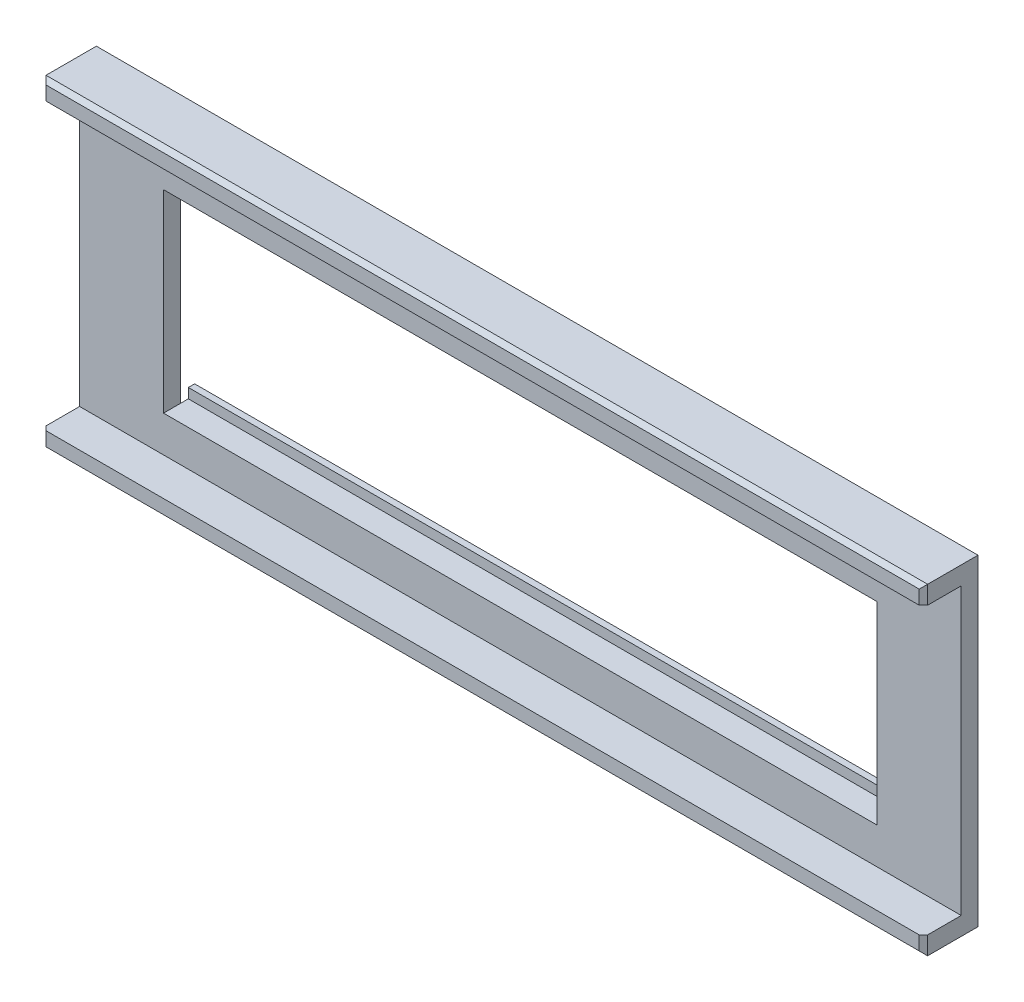
ISO-10303-21;
HEADER;
FILE_DESCRIPTION(('STEP AP214'),'2;1');
FILE_NAME('part.step','',(''),(''),'','','');
FILE_SCHEMA(('AUTOMOTIVE_DESIGN { 1 0 10303 214 1 1 1 1 }'));
ENDSEC;
DATA;
#1=APPLICATION_CONTEXT('core data for automotive mechanical design processes');
#2=APPLICATION_PROTOCOL_DEFINITION('international standard','automotive_design',2000,#1);
#3=PRODUCT_CONTEXT('',#1,'mechanical');
#4=PRODUCT('Part','Part','',(#3));
#5=PRODUCT_RELATED_PRODUCT_CATEGORY('part','',(#4));
#6=PRODUCT_DEFINITION_FORMATION('','',#4);
#7=PRODUCT_DEFINITION_CONTEXT('part definition',#1,'design');
#8=PRODUCT_DEFINITION('design','',#6,#7);
#9=PRODUCT_DEFINITION_SHAPE('','',#8);
#10=(LENGTH_UNIT() NAMED_UNIT(*) SI_UNIT(.MILLI.,.METRE.));
#11=(NAMED_UNIT(*) PLANE_ANGLE_UNIT() SI_UNIT($,.RADIAN.));
#12=(NAMED_UNIT(*) SI_UNIT($,.STERADIAN.) SOLID_ANGLE_UNIT());
#13=UNCERTAINTY_MEASURE_WITH_UNIT(LENGTH_MEASURE(1.E-05),#10,'distance_accuracy_value','');
#14=(GEOMETRIC_REPRESENTATION_CONTEXT(3) GLOBAL_UNCERTAINTY_ASSIGNED_CONTEXT((#13)) GLOBAL_UNIT_ASSIGNED_CONTEXT((#10,
#11,#12)) REPRESENTATION_CONTEXT('',''));
#15=CARTESIAN_POINT('',(0.,0.,0.));
#16=DIRECTION('',(0.,0.,1.));
#17=DIRECTION('',(1.,0.,0.));
#18=AXIS2_PLACEMENT_3D('',#15,#16,#17);
#19=CARTESIAN_POINT('',(105.,-38.325,13.));
#20=DIRECTION('',(-1.,0.,0.));
#21=DIRECTION('',(0.,0.,1.));
#22=AXIS2_PLACEMENT_3D('',#19,#20,#21);
#23=PLANE('',#22);
#24=DIRECTION('',(0.,1.,0.));
#25=VECTOR('',#24,1.);
#26=CARTESIAN_POINT('',(105.,-38.325,0.));
#27=LINE('',#26,#25);
#28=CARTESIAN_POINT('',(105.,-38.325,0.));
#29=VERTEX_POINT('',#28);
#30=CARTESIAN_POINT('',(105.,38.325,0.));
#31=VERTEX_POINT('',#30);
#32=EDGE_CURVE('E357',#29,#31,#27,.T.);
#33=ORIENTED_EDGE('',*,*,#32,.T.);
#34=DIRECTION('',(0.,0.,-1.));
#35=VECTOR('',#34,1.);
#36=CARTESIAN_POINT('',(105.,38.325,13.));
#37=LINE('',#36,#35);
#38=CARTESIAN_POINT('',(105.,38.325,12.));
#39=VERTEX_POINT('',#38);
#40=EDGE_CURVE('E364',#39,#31,#37,.T.);
#41=ORIENTED_EDGE('',*,*,#40,.F.);
#42=DIRECTION('',(0.,-1.,0.));
#43=VECTOR('',#42,1.);
#44=CARTESIAN_POINT('',(105.,-38.325,12.));
#45=LINE('',#44,#43);
#46=CARTESIAN_POINT('',(105.,34.,12.));
#47=VERTEX_POINT('',#46);
#48=EDGE_CURVE('E392',#39,#47,#45,.T.);
#49=ORIENTED_EDGE('',*,*,#48,.T.);
#50=DIRECTION('',(0.,0.,1.));
#51=VECTOR('',#50,1.);
#52=CARTESIAN_POINT('',(105.,34.,4.));
#53=LINE('',#52,#51);
#54=CARTESIAN_POINT('',(105.,34.,4.));
#55=VERTEX_POINT('',#54);
#56=EDGE_CURVE('E311',#55,#47,#53,.T.);
#57=ORIENTED_EDGE('',*,*,#56,.F.);
#58=DIRECTION('',(0.,1.,0.));
#59=VECTOR('',#58,1.);
#60=CARTESIAN_POINT('',(105.,-34.,4.));
#61=LINE('',#60,#59);
#62=CARTESIAN_POINT('',(105.,-34.,4.));
#63=VERTEX_POINT('',#62);
#64=EDGE_CURVE('E300',#63,#55,#61,.T.);
#65=ORIENTED_EDGE('',*,*,#64,.F.);
#66=DIRECTION('',(0.,0.,1.));
#67=VECTOR('',#66,1.);
#68=CARTESIAN_POINT('',(105.,-34.,4.));
#69=LINE('',#68,#67);
#70=CARTESIAN_POINT('',(105.,-34.,12.));
#71=VERTEX_POINT('',#70);
#72=EDGE_CURVE('E318',#63,#71,#69,.T.);
#73=ORIENTED_EDGE('',*,*,#72,.T.);
#74=DIRECTION('',(0.,-1.,0.));
#75=VECTOR('',#74,1.);
#76=CARTESIAN_POINT('',(105.,-38.325,12.));
#77=LINE('',#76,#75);
#78=CARTESIAN_POINT('',(105.,-38.325,12.));
#79=VERTEX_POINT('',#78);
#80=EDGE_CURVE('E394',#71,#79,#77,.T.);
#81=ORIENTED_EDGE('',*,*,#80,.T.);
#82=DIRECTION('',(0.,0.,-1.));
#83=VECTOR('',#82,1.);
#84=CARTESIAN_POINT('',(105.,-38.325,13.));
#85=LINE('',#84,#83);
#86=EDGE_CURVE('E367',#79,#29,#85,.T.);
#87=ORIENTED_EDGE('',*,*,#86,.T.);
#88=EDGE_LOOP('',(#33,#41,#49,#57,#65,#73,#81,#87));
#89=FACE_BOUND('',#88,.T.);
#90=ADVANCED_FACE('F37',(#89),#23,.F.);
#91=CARTESIAN_POINT('',(0.,0.,13.));
#92=DIRECTION('',(0.,0.,-1.));
#93=DIRECTION('',(-1.,0.,0.));
#94=AXIS2_PLACEMENT_3D('',#91,#92,#93);
#95=PLANE('',#94);
#96=DIRECTION('',(1.,0.,0.));
#97=VECTOR('',#96,1.);
#98=CARTESIAN_POINT('',(-105.,-34.,13.));
#99=LINE('',#98,#97);
#100=CARTESIAN_POINT('',(-104.,-34.,13.));
#101=VERTEX_POINT('',#100);
#102=CARTESIAN_POINT('',(104.,-34.,13.));
#103=VERTEX_POINT('',#102);
#104=EDGE_CURVE('E304',#101,#103,#99,.T.);
#105=ORIENTED_EDGE('',*,*,#104,.F.);
#106=DIRECTION('',(0.,-1.,0.));
#107=VECTOR('',#106,1.);
#108=CARTESIAN_POINT('',(-104.,0.,13.));
#109=LINE('',#108,#107);
#110=CARTESIAN_POINT('',(-104.,-37.325,13.));
#111=VERTEX_POINT('',#110);
#112=EDGE_CURVE('E379',#101,#111,#109,.T.);
#113=ORIENTED_EDGE('',*,*,#112,.T.);
#114=DIRECTION('',(1.,0.,0.));
#115=VECTOR('',#114,1.);
#116=CARTESIAN_POINT('',(0.,-37.325,13.));
#117=LINE('',#116,#115);
#118=CARTESIAN_POINT('',(104.,-37.325,13.));
#119=VERTEX_POINT('',#118);
#120=EDGE_CURVE('E377',#111,#119,#117,.T.);
#121=ORIENTED_EDGE('',*,*,#120,.T.);
#122=DIRECTION('',(0.,1.,0.));
#123=VECTOR('',#122,1.);
#124=CARTESIAN_POINT('',(104.,0.,13.));
#125=LINE('',#124,#123);
#126=EDGE_CURVE('E375',#119,#103,#125,.T.);
#127=ORIENTED_EDGE('',*,*,#126,.T.);
#128=EDGE_LOOP('',(#105,#113,#121,#127));
#129=FACE_BOUND('',#128,.T.);
#130=ADVANCED_FACE('F603',(#129),#95,.F.);
#131=DIRECTION('',(-1.,0.,0.));
#132=VECTOR('',#131,1.);
#133=CARTESIAN_POINT('',(-105.,34.,13.));
#134=LINE('',#133,#132);
#135=CARTESIAN_POINT('',(104.,34.,13.));
#136=VERTEX_POINT('',#135);
#137=CARTESIAN_POINT('',(-104.,34.,13.));
#138=VERTEX_POINT('',#137);
#139=EDGE_CURVE('E312',#136,#138,#134,.T.);
#140=ORIENTED_EDGE('',*,*,#139,.F.);
#141=DIRECTION('',(0.,1.,0.));
#142=VECTOR('',#141,1.);
#143=CARTESIAN_POINT('',(104.,0.,13.));
#144=LINE('',#143,#142);
#145=CARTESIAN_POINT('',(104.,37.325,13.));
#146=VERTEX_POINT('',#145);
#147=EDGE_CURVE('E400',#136,#146,#144,.T.);
#148=ORIENTED_EDGE('',*,*,#147,.T.);
#149=DIRECTION('',(-1.,0.,0.));
#150=VECTOR('',#149,1.);
#151=CARTESIAN_POINT('',(0.,37.325,13.));
#152=LINE('',#151,#150);
#153=CARTESIAN_POINT('',(-104.,37.325,13.));
#154=VERTEX_POINT('',#153);
#155=EDGE_CURVE('E396',#146,#154,#152,.T.);
#156=ORIENTED_EDGE('',*,*,#155,.T.);
#157=DIRECTION('',(0.,-1.,0.));
#158=VECTOR('',#157,1.);
#159=CARTESIAN_POINT('',(-104.,0.,13.));
#160=LINE('',#159,#158);
#161=EDGE_CURVE('E398',#154,#138,#160,.T.);
#162=ORIENTED_EDGE('',*,*,#161,.T.);
#163=EDGE_LOOP('',(#140,#148,#156,#162));
#164=FACE_BOUND('',#163,.T.);
#165=ADVANCED_FACE('F609',(#164),#95,.F.);
#166=CARTESIAN_POINT('',(0.,0.,0.));
#167=DIRECTION('',(0.,0.,-1.));
#168=DIRECTION('',(-1.,0.,0.));
#169=AXIS2_PLACEMENT_3D('',#166,#167,#168);
#170=PLANE('',#169);
#171=DIRECTION('',(1.,0.,0.));
#172=VECTOR('',#171,1.);
#173=CARTESIAN_POINT('',(-105.,-31.275,0.));
#174=LINE('',#173,#172);
#175=CARTESIAN_POINT('',(-85.,-31.275,0.));
#176=VERTEX_POINT('',#175);
#177=CARTESIAN_POINT('',(85.,-31.275,0.));
#178=VERTEX_POINT('',#177);
#179=EDGE_CURVE('E299',#176,#178,#174,.T.);
#180=ORIENTED_EDGE('',*,*,#179,.T.);
#181=DIRECTION('',(0.,1.,0.));
#182=VECTOR('',#181,1.);
#183=CARTESIAN_POINT('',(85.,38.325,0.));
#184=LINE('',#183,#182);
#185=CARTESIAN_POINT('',(85.,-25.375,0.));
#186=VERTEX_POINT('',#185);
#187=EDGE_CURVE('E534',#178,#186,#184,.T.);
#188=ORIENTED_EDGE('',*,*,#187,.T.);
#189=DIRECTION('',(0.,1.,0.));
#190=VECTOR('',#189,1.);
#191=CARTESIAN_POINT('',(85.,20.725,0.));
#192=LINE('',#191,#190);
#193=CARTESIAN_POINT('',(85.,20.725,0.));
#194=VERTEX_POINT('',#193);
#195=EDGE_CURVE('E338',#186,#194,#192,.T.);
#196=ORIENTED_EDGE('',*,*,#195,.T.);
#197=CARTESIAN_POINT('',(85.,26.625,0.));
#198=VERTEX_POINT('',#197);
#199=EDGE_CURVE('E528',#194,#198,#184,.T.);
#200=ORIENTED_EDGE('',*,*,#199,.T.);
#201=DIRECTION('',(1.,0.,0.));
#202=VECTOR('',#201,1.);
#203=CARTESIAN_POINT('',(-105.,26.625,0.));
#204=LINE('',#203,#202);
#205=CARTESIAN_POINT('',(-85.,26.625,0.));
#206=VERTEX_POINT('',#205);
#207=EDGE_CURVE('E416',#206,#198,#204,.T.);
#208=ORIENTED_EDGE('',*,*,#207,.F.);
#209=DIRECTION('',(0.,-1.,0.));
#210=VECTOR('',#209,1.);
#211=CARTESIAN_POINT('',(-85.,38.325,0.));
#212=LINE('',#211,#210);
#213=CARTESIAN_POINT('',(-85.,20.725,0.));
#214=VERTEX_POINT('',#213);
#215=EDGE_CURVE('E526',#206,#214,#212,.T.);
#216=ORIENTED_EDGE('',*,*,#215,.T.);
#217=DIRECTION('',(0.,-1.,0.));
#218=VECTOR('',#217,1.);
#219=CARTESIAN_POINT('',(-85.,20.725,0.));
#220=LINE('',#219,#218);
#221=CARTESIAN_POINT('',(-85.,-25.375,0.));
#222=VERTEX_POINT('',#221);
#223=EDGE_CURVE('E335',#214,#222,#220,.T.);
#224=ORIENTED_EDGE('',*,*,#223,.T.);
#225=EDGE_CURVE('E277',#222,#176,#212,.T.);
#226=ORIENTED_EDGE('',*,*,#225,.T.);
#227=EDGE_LOOP('',(#180,#188,#196,#200,#208,#216,#224,#226));
#228=FACE_BOUND('',#227,.T.);
#229=DIRECTION('',(0.,-1.,0.));
#230=VECTOR('',#229,1.);
#231=CARTESIAN_POINT('',(-105.,-38.325,0.));
#232=LINE('',#231,#230);
#233=CARTESIAN_POINT('',(-105.,38.325,0.));
#234=VERTEX_POINT('',#233);
#235=CARTESIAN_POINT('',(-105.,-38.325,0.));
#236=VERTEX_POINT('',#235);
#237=EDGE_CURVE('E353',#234,#236,#232,.T.);
#238=ORIENTED_EDGE('',*,*,#237,.F.);
#239=DIRECTION('',(-1.,0.,0.));
#240=VECTOR('',#239,1.);
#241=CARTESIAN_POINT('',(-105.,38.325,0.));
#242=LINE('',#241,#240);
#243=EDGE_CURVE('E359',#31,#234,#242,.T.);
#244=ORIENTED_EDGE('',*,*,#243,.F.);
#245=ORIENTED_EDGE('',*,*,#32,.F.);
#246=DIRECTION('',(1.,0.,0.));
#247=VECTOR('',#246,1.);
#248=CARTESIAN_POINT('',(-105.,-38.325,0.));
#249=LINE('',#248,#247);
#250=EDGE_CURVE('E355',#236,#29,#249,.T.);
#251=ORIENTED_EDGE('',*,*,#250,.F.);
#252=EDGE_LOOP('',(#238,#244,#245,#251));
#253=FACE_BOUND('',#252,.T.);
#254=ADVANCED_FACE('F556',(#228,#253),#170,.T.);
#255=CARTESIAN_POINT('',(-105.,-38.325,13.));
#256=DIRECTION('',(1.,0.,0.));
#257=DIRECTION('',(0.,0.,-1.));
#258=AXIS2_PLACEMENT_3D('',#255,#256,#257);
#259=PLANE('',#258);
#260=ORIENTED_EDGE('',*,*,#237,.T.);
#261=DIRECTION('',(0.,0.,-1.));
#262=VECTOR('',#261,1.);
#263=CARTESIAN_POINT('',(-105.,-38.325,13.));
#264=LINE('',#263,#262);
#265=CARTESIAN_POINT('',(-105.,-38.325,12.));
#266=VERTEX_POINT('',#265);
#267=EDGE_CURVE('E370',#266,#236,#264,.T.);
#268=ORIENTED_EDGE('',*,*,#267,.F.);
#269=DIRECTION('',(0.,1.,0.));
#270=VECTOR('',#269,1.);
#271=CARTESIAN_POINT('',(-105.,-38.325,12.));
#272=LINE('',#271,#270);
#273=CARTESIAN_POINT('',(-105.,-34.,12.));
#274=VERTEX_POINT('',#273);
#275=EDGE_CURVE('E384',#266,#274,#272,.T.);
#276=ORIENTED_EDGE('',*,*,#275,.T.);
#277=DIRECTION('',(0.,0.,1.));
#278=VECTOR('',#277,1.);
#279=CARTESIAN_POINT('',(-105.,-34.,4.));
#280=LINE('',#279,#278);
#281=CARTESIAN_POINT('',(-105.,-34.,4.));
#282=VERTEX_POINT('',#281);
#283=EDGE_CURVE('E322',#282,#274,#280,.T.);
#284=ORIENTED_EDGE('',*,*,#283,.F.);
#285=DIRECTION('',(0.,-1.,0.));
#286=VECTOR('',#285,1.);
#287=CARTESIAN_POINT('',(-105.,-34.,4.));
#288=LINE('',#287,#286);
#289=CARTESIAN_POINT('',(-105.,34.,4.));
#290=VERTEX_POINT('',#289);
#291=EDGE_CURVE('E307',#290,#282,#288,.T.);
#292=ORIENTED_EDGE('',*,*,#291,.F.);
#293=DIRECTION('',(0.,0.,1.));
#294=VECTOR('',#293,1.);
#295=CARTESIAN_POINT('',(-105.,34.,4.));
#296=LINE('',#295,#294);
#297=CARTESIAN_POINT('',(-105.,34.,12.));
#298=VERTEX_POINT('',#297);
#299=EDGE_CURVE('E325',#290,#298,#296,.T.);
#300=ORIENTED_EDGE('',*,*,#299,.T.);
#301=DIRECTION('',(0.,1.,0.));
#302=VECTOR('',#301,1.);
#303=CARTESIAN_POINT('',(-105.,-38.325,12.));
#304=LINE('',#303,#302);
#305=CARTESIAN_POINT('',(-105.,38.325,12.));
#306=VERTEX_POINT('',#305);
#307=EDGE_CURVE('E382',#298,#306,#304,.T.);
#308=ORIENTED_EDGE('',*,*,#307,.T.);
#309=DIRECTION('',(0.,0.,-1.));
#310=VECTOR('',#309,1.);
#311=CARTESIAN_POINT('',(-105.,38.325,13.));
#312=LINE('',#311,#310);
#313=EDGE_CURVE('E361',#306,#234,#312,.T.);
#314=ORIENTED_EDGE('',*,*,#313,.T.);
#315=EDGE_LOOP('',(#260,#268,#276,#284,#292,#300,#308,#314));
#316=FACE_BOUND('',#315,.T.);
#317=ADVANCED_FACE('F619',(#316),#259,.F.);
#318=CARTESIAN_POINT('',(-105.,-38.325,13.));
#319=DIRECTION('',(0.,1.,0.));
#320=DIRECTION('',(0.,0.,1.));
#321=AXIS2_PLACEMENT_3D('',#318,#319,#320);
#322=PLANE('',#321);
#323=ORIENTED_EDGE('',*,*,#86,.F.);
#324=DIRECTION('',(-1.,0.,0.));
#325=VECTOR('',#324,1.);
#326=CARTESIAN_POINT('',(-105.,-38.325,12.));
#327=LINE('',#326,#325);
#328=EDGE_CURVE('E390',#79,#266,#327,.T.);
#329=ORIENTED_EDGE('',*,*,#328,.T.);
#330=ORIENTED_EDGE('',*,*,#267,.T.);
#331=ORIENTED_EDGE('',*,*,#250,.T.);
#332=EDGE_LOOP('',(#323,#329,#330,#331));
#333=FACE_BOUND('',#332,.T.);
#334=ADVANCED_FACE('F616',(#333),#322,.F.);
#335=CARTESIAN_POINT('',(-105.,38.325,13.));
#336=DIRECTION('',(0.,-1.,0.));
#337=DIRECTION('',(0.,0.,-1.));
#338=AXIS2_PLACEMENT_3D('',#335,#336,#337);
#339=PLANE('',#338);
#340=ORIENTED_EDGE('',*,*,#313,.F.);
#341=DIRECTION('',(1.,0.,0.));
#342=VECTOR('',#341,1.);
#343=CARTESIAN_POINT('',(-105.,38.325,12.));
#344=LINE('',#343,#342);
#345=EDGE_CURVE('E407',#306,#39,#344,.T.);
#346=ORIENTED_EDGE('',*,*,#345,.T.);
#347=ORIENTED_EDGE('',*,*,#40,.T.);
#348=ORIENTED_EDGE('',*,*,#243,.T.);
#349=EDGE_LOOP('',(#340,#346,#347,#348));
#350=FACE_BOUND('',#349,.T.);
#351=ADVANCED_FACE('F614',(#350),#339,.F.);
#352=CARTESIAN_POINT('',(-85.,20.725,13.));
#353=DIRECTION('',(1.,0.,0.));
#354=DIRECTION('',(0.,0.,-1.));
#355=AXIS2_PLACEMENT_3D('',#352,#353,#354);
#356=PLANE('',#355);
#357=DIRECTION('',(0.,1.,0.));
#358=VECTOR('',#357,1.);
#359=CARTESIAN_POINT('',(-85.,20.725,4.));
#360=LINE('',#359,#358);
#361=CARTESIAN_POINT('',(-85.,-25.375,4.));
#362=VERTEX_POINT('',#361);
#363=CARTESIAN_POINT('',(-85.,20.725,4.));
#364=VERTEX_POINT('',#363);
#365=EDGE_CURVE('E333',#362,#364,#360,.T.);
#366=ORIENTED_EDGE('',*,*,#365,.F.);
#367=DIRECTION('',(0.,0.,-1.));
#368=VECTOR('',#367,1.);
#369=CARTESIAN_POINT('',(-85.,-25.375,13.));
#370=LINE('',#369,#368);
#371=EDGE_CURVE('E350',#362,#222,#370,.T.);
#372=ORIENTED_EDGE('',*,*,#371,.T.);
#373=ORIENTED_EDGE('',*,*,#223,.F.);
#374=DIRECTION('',(0.,0.,-1.));
#375=VECTOR('',#374,1.);
#376=CARTESIAN_POINT('',(-85.,20.725,13.));
#377=LINE('',#376,#375);
#378=EDGE_CURVE('E341',#364,#214,#377,.T.);
#379=ORIENTED_EDGE('',*,*,#378,.F.);
#380=EDGE_LOOP('',(#366,#372,#373,#379));
#381=FACE_BOUND('',#380,.T.);
#382=ADVANCED_FACE('F579',(#381),#356,.T.);
#383=CARTESIAN_POINT('',(-85.,-25.375,13.));
#384=DIRECTION('',(0.,1.,0.));
#385=DIRECTION('',(0.,0.,1.));
#386=AXIS2_PLACEMENT_3D('',#383,#384,#385);
#387=PLANE('',#386);
#388=DIRECTION('',(0.,0.,1.));
#389=VECTOR('',#388,1.);
#390=CARTESIAN_POINT('',(85.,-25.375,13.));
#391=LINE('',#390,#389);
#392=CARTESIAN_POINT('',(85.,-25.375,-1.9));
#393=VERTEX_POINT('',#392);
#394=EDGE_CURVE('E514',#393,#186,#391,.T.);
#395=ORIENTED_EDGE('',*,*,#394,.F.);
#396=DIRECTION('',(1.,0.,0.));
#397=VECTOR('',#396,1.);
#398=CARTESIAN_POINT('',(-105.,-25.375,-1.9));
#399=LINE('',#398,#397);
#400=CARTESIAN_POINT('',(-85.,-25.375,-1.9));
#401=VERTEX_POINT('',#400);
#402=EDGE_CURVE('E473',#401,#393,#399,.T.);
#403=ORIENTED_EDGE('',*,*,#402,.F.);
#404=DIRECTION('',(0.,0.,-1.));
#405=VECTOR('',#404,1.);
#406=CARTESIAN_POINT('',(-85.,-25.375,13.));
#407=LINE('',#406,#405);
#408=EDGE_CURVE('E541',#222,#401,#407,.T.);
#409=ORIENTED_EDGE('',*,*,#408,.F.);
#410=ORIENTED_EDGE('',*,*,#371,.F.);
#411=DIRECTION('',(-1.,0.,0.));
#412=VECTOR('',#411,1.);
#413=CARTESIAN_POINT('',(-85.,-25.375,4.));
#414=LINE('',#413,#412);
#415=CARTESIAN_POINT('',(85.,-25.375,4.));
#416=VERTEX_POINT('',#415);
#417=EDGE_CURVE('E331',#416,#362,#414,.T.);
#418=ORIENTED_EDGE('',*,*,#417,.F.);
#419=DIRECTION('',(0.,0.,-1.));
#420=VECTOR('',#419,1.);
#421=CARTESIAN_POINT('',(85.,-25.375,13.));
#422=LINE('',#421,#420);
#423=EDGE_CURVE('E347',#416,#186,#422,.T.);
#424=ORIENTED_EDGE('',*,*,#423,.T.);
#425=EDGE_LOOP('',(#395,#403,#409,#410,#418,#424));
#426=FACE_BOUND('',#425,.T.);
#427=ADVANCED_FACE('F568',(#426),#387,.T.);
#428=CARTESIAN_POINT('',(85.,20.725,13.));
#429=DIRECTION('',(-1.,0.,0.));
#430=DIRECTION('',(0.,0.,1.));
#431=AXIS2_PLACEMENT_3D('',#428,#429,#430);
#432=PLANE('',#431);
#433=DIRECTION('',(0.,-1.,0.));
#434=VECTOR('',#433,1.);
#435=CARTESIAN_POINT('',(85.,20.725,4.));
#436=LINE('',#435,#434);
#437=CARTESIAN_POINT('',(85.,20.725,4.));
#438=VERTEX_POINT('',#437);
#439=EDGE_CURVE('E321',#438,#416,#436,.T.);
#440=ORIENTED_EDGE('',*,*,#439,.F.);
#441=DIRECTION('',(0.,0.,-1.));
#442=VECTOR('',#441,1.);
#443=CARTESIAN_POINT('',(85.,20.725,13.));
#444=LINE('',#443,#442);
#445=EDGE_CURVE('E344',#438,#194,#444,.T.);
#446=ORIENTED_EDGE('',*,*,#445,.T.);
#447=ORIENTED_EDGE('',*,*,#195,.F.);
#448=ORIENTED_EDGE('',*,*,#423,.F.);
#449=EDGE_LOOP('',(#440,#446,#447,#448));
#450=FACE_BOUND('',#449,.T.);
#451=ADVANCED_FACE('F563',(#450),#432,.T.);
#452=CARTESIAN_POINT('',(-85.,20.725,13.));
#453=DIRECTION('',(0.,-1.,0.));
#454=DIRECTION('',(0.,0.,-1.));
#455=AXIS2_PLACEMENT_3D('',#452,#453,#454);
#456=PLANE('',#455);
#457=DIRECTION('',(0.,0.,-1.));
#458=VECTOR('',#457,1.);
#459=CARTESIAN_POINT('',(85.,20.725,13.));
#460=LINE('',#459,#458);
#461=CARTESIAN_POINT('',(85.,20.725,-1.9));
#462=VERTEX_POINT('',#461);
#463=EDGE_CURVE('E61',#194,#462,#460,.T.);
#464=ORIENTED_EDGE('',*,*,#463,.F.);
#465=ORIENTED_EDGE('',*,*,#445,.F.);
#466=DIRECTION('',(1.,0.,0.));
#467=VECTOR('',#466,1.);
#468=CARTESIAN_POINT('',(-85.,20.725,4.));
#469=LINE('',#468,#467);
#470=EDGE_CURVE('E373',#364,#438,#469,.T.);
#471=ORIENTED_EDGE('',*,*,#470,.F.);
#472=ORIENTED_EDGE('',*,*,#378,.T.);
#473=DIRECTION('',(0.,0.,1.));
#474=VECTOR('',#473,1.);
#475=CARTESIAN_POINT('',(-85.,20.725,13.));
#476=LINE('',#475,#474);
#477=CARTESIAN_POINT('',(-85.,20.725,-1.9));
#478=VERTEX_POINT('',#477);
#479=EDGE_CURVE('E267',#478,#214,#476,.T.);
#480=ORIENTED_EDGE('',*,*,#479,.F.);
#481=DIRECTION('',(1.,0.,0.));
#482=VECTOR('',#481,1.);
#483=CARTESIAN_POINT('',(-105.,20.725,-1.9));
#484=LINE('',#483,#482);
#485=EDGE_CURVE('E296',#478,#462,#484,.T.);
#486=ORIENTED_EDGE('',*,*,#485,.T.);
#487=EDGE_LOOP('',(#464,#465,#471,#472,#480,#486));
#488=FACE_BOUND('',#487,.T.);
#489=ADVANCED_FACE('F583',(#488),#456,.T.);
#490=CARTESIAN_POINT('',(-105.,-34.,4.));
#491=DIRECTION('',(0.,-1.,0.));
#492=DIRECTION('',(1.,0.,0.));
#493=AXIS2_PLACEMENT_3D('',#490,#491,#492);
#494=PLANE('',#493);
#495=ORIENTED_EDGE('',*,*,#283,.T.);
#496=DIRECTION('',(-0.707106781186548,0.,-0.707106781186548));
#497=VECTOR('',#496,1.);
#498=CARTESIAN_POINT('',(-104.,-34.,13.));
#499=LINE('',#498,#497);
#500=EDGE_CURVE('E388',#274,#101,#499,.F.);
#501=ORIENTED_EDGE('',*,*,#500,.T.);
#502=ORIENTED_EDGE('',*,*,#104,.T.);
#503=DIRECTION('',(-0.707106781186548,0.,0.707106781186548));
#504=VECTOR('',#503,1.);
#505=CARTESIAN_POINT('',(104.,-34.,13.));
#506=LINE('',#505,#504);
#507=EDGE_CURVE('E386',#103,#71,#506,.F.);
#508=ORIENTED_EDGE('',*,*,#507,.T.);
#509=ORIENTED_EDGE('',*,*,#72,.F.);
#510=DIRECTION('',(1.,0.,0.));
#511=VECTOR('',#510,1.);
#512=CARTESIAN_POINT('',(-105.,-34.,4.));
#513=LINE('',#512,#511);
#514=EDGE_CURVE('E309',#282,#63,#513,.T.);
#515=ORIENTED_EDGE('',*,*,#514,.F.);
#516=EDGE_LOOP('',(#495,#501,#502,#508,#509,#515));
#517=FACE_BOUND('',#516,.T.);
#518=ADVANCED_FACE('F697',(#517),#494,.F.);
#519=CARTESIAN_POINT('',(-105.,34.,4.));
#520=DIRECTION('',(0.,1.,0.));
#521=DIRECTION('',(-1.,0.,0.));
#522=AXIS2_PLACEMENT_3D('',#519,#520,#521);
#523=PLANE('',#522);
#524=ORIENTED_EDGE('',*,*,#56,.T.);
#525=DIRECTION('',(0.707106781186538,0.,-0.707106781186557));
#526=VECTOR('',#525,1.);
#527=CARTESIAN_POINT('',(104.,34.,13.));
#528=LINE('',#527,#526);
#529=EDGE_CURVE('E405',#47,#136,#528,.F.);
#530=ORIENTED_EDGE('',*,*,#529,.T.);
#531=ORIENTED_EDGE('',*,*,#139,.T.);
#532=DIRECTION('',(0.707106781186538,0.,0.707106781186557));
#533=VECTOR('',#532,1.);
#534=CARTESIAN_POINT('',(-104.,34.,13.));
#535=LINE('',#534,#533);
#536=EDGE_CURVE('E403',#138,#298,#535,.F.);
#537=ORIENTED_EDGE('',*,*,#536,.T.);
#538=ORIENTED_EDGE('',*,*,#299,.F.);
#539=DIRECTION('',(-1.,0.,0.));
#540=VECTOR('',#539,1.);
#541=CARTESIAN_POINT('',(-105.,34.,4.));
#542=LINE('',#541,#540);
#543=EDGE_CURVE('E303',#55,#290,#542,.T.);
#544=ORIENTED_EDGE('',*,*,#543,.F.);
#545=EDGE_LOOP('',(#524,#530,#531,#537,#538,#544));
#546=FACE_BOUND('',#545,.T.);
#547=ADVANCED_FACE('F672',(#546),#523,.F.);
#548=CARTESIAN_POINT('',(0.,0.,4.));
#549=DIRECTION('',(0.,0.,-1.));
#550=DIRECTION('',(-1.,0.,0.));
#551=AXIS2_PLACEMENT_3D('',#548,#549,#550);
#552=PLANE('',#551);
#553=ORIENTED_EDGE('',*,*,#365,.T.);
#554=ORIENTED_EDGE('',*,*,#470,.T.);
#555=ORIENTED_EDGE('',*,*,#439,.T.);
#556=ORIENTED_EDGE('',*,*,#417,.T.);
#557=EDGE_LOOP('',(#553,#554,#555,#556));
#558=FACE_BOUND('',#557,.T.);
#559=ORIENTED_EDGE('',*,*,#64,.T.);
#560=ORIENTED_EDGE('',*,*,#543,.T.);
#561=ORIENTED_EDGE('',*,*,#291,.T.);
#562=ORIENTED_EDGE('',*,*,#514,.T.);
#563=EDGE_LOOP('',(#559,#560,#561,#562));
#564=FACE_BOUND('',#563,.T.);
#565=ADVANCED_FACE('F574',(#558,#564),#552,.F.);
#566=CARTESIAN_POINT('',(104.,0.,13.));
#567=DIRECTION('',(-0.707106781186548,0.,-0.707106781186548));
#568=DIRECTION('',(0.,1.,0.));
#569=AXIS2_PLACEMENT_3D('',#566,#567,#568);
#570=PLANE('',#569);
#571=ORIENTED_EDGE('',*,*,#507,.F.);
#572=ORIENTED_EDGE('',*,*,#126,.F.);
#573=DIRECTION('',(0.577350269189626,-0.577350269189626,-0.577350269189626));
#574=VECTOR('',#573,1.);
#575=CARTESIAN_POINT('',(91.5583333333333,-24.8833333333333,25.4416666666667));
#576=LINE('',#575,#574);
#577=EDGE_CURVE('E315',#79,#119,#576,.F.);
#578=ORIENTED_EDGE('',*,*,#577,.F.);
#579=ORIENTED_EDGE('',*,*,#80,.F.);
#580=EDGE_LOOP('',(#571,#572,#578,#579));
#581=FACE_BOUND('',#580,.T.);
#582=ADVANCED_FACE('F638',(#581),#570,.F.);
#583=CARTESIAN_POINT('',(0.,-37.325,13.));
#584=DIRECTION('',(0.,0.707106781186548,-0.707106781186548));
#585=DIRECTION('',(1.,0.,0.));
#586=AXIS2_PLACEMENT_3D('',#583,#584,#585);
#587=PLANE('',#586);
#588=ORIENTED_EDGE('',*,*,#577,.T.);
#589=ORIENTED_EDGE('',*,*,#120,.F.);
#590=DIRECTION('',(-0.577350269189626,-0.577350269189626,-0.577350269189626));
#591=VECTOR('',#590,1.);
#592=CARTESIAN_POINT('',(-69.3333333333333,-2.65833333333333,47.6666666666666));
#593=LINE('',#592,#591);
#594=EDGE_CURVE('E409',#266,#111,#593,.F.);
#595=ORIENTED_EDGE('',*,*,#594,.F.);
#596=ORIENTED_EDGE('',*,*,#328,.F.);
#597=EDGE_LOOP('',(#588,#589,#595,#596));
#598=FACE_BOUND('',#597,.T.);
#599=ADVANCED_FACE('F631',(#598),#587,.F.);
#600=CARTESIAN_POINT('',(-104.,0.,13.));
#601=DIRECTION('',(0.707106781186548,0.,-0.707106781186548));
#602=DIRECTION('',(0.,-1.,0.));
#603=AXIS2_PLACEMENT_3D('',#600,#601,#602);
#604=PLANE('',#603);
#605=ORIENTED_EDGE('',*,*,#500,.F.);
#606=ORIENTED_EDGE('',*,*,#275,.F.);
#607=ORIENTED_EDGE('',*,*,#594,.T.);
#608=ORIENTED_EDGE('',*,*,#112,.F.);
#609=EDGE_LOOP('',(#605,#606,#607,#608));
#610=FACE_BOUND('',#609,.T.);
#611=ADVANCED_FACE('F625',(#610),#604,.F.);
#612=CARTESIAN_POINT('',(-104.,0.,13.));
#613=DIRECTION('',(0.707106781186557,0.,-0.707106781186538));
#614=DIRECTION('',(0.,-1.,0.));
#615=AXIS2_PLACEMENT_3D('',#612,#613,#614);
#616=PLANE('',#615);
#617=ORIENTED_EDGE('',*,*,#536,.F.);
#618=ORIENTED_EDGE('',*,*,#161,.F.);
#619=DIRECTION('',(0.57735026918962,-0.57735026918962,0.577350269189636));
#620=VECTOR('',#619,1.);
#621=CARTESIAN_POINT('',(-69.333333333334,2.658333333334,47.666666666667));
#622=LINE('',#621,#620);
#623=EDGE_CURVE('E411',#306,#154,#622,.T.);
#624=ORIENTED_EDGE('',*,*,#623,.F.);
#625=ORIENTED_EDGE('',*,*,#307,.F.);
#626=EDGE_LOOP('',(#617,#618,#624,#625));
#627=FACE_BOUND('',#626,.T.);
#628=ADVANCED_FACE('F40',(#627),#616,.F.);
#629=CARTESIAN_POINT('',(0.,37.325,13.));
#630=DIRECTION('',(0.,-0.707106781186557,-0.707106781186538));
#631=DIRECTION('',(-1.,0.,0.));
#632=AXIS2_PLACEMENT_3D('',#629,#630,#631);
#633=PLANE('',#632);
#634=ORIENTED_EDGE('',*,*,#623,.T.);
#635=ORIENTED_EDGE('',*,*,#155,.F.);
#636=DIRECTION('',(0.57735026918962,0.57735026918962,-0.577350269189636));
#637=VECTOR('',#636,1.);
#638=CARTESIAN_POINT('',(69.333333333334,2.658333333334,47.666666666667));
#639=LINE('',#638,#637);
#640=EDGE_CURVE('E414',#39,#146,#639,.F.);
#641=ORIENTED_EDGE('',*,*,#640,.F.);
#642=ORIENTED_EDGE('',*,*,#345,.F.);
#643=EDGE_LOOP('',(#634,#635,#641,#642));
#644=FACE_BOUND('',#643,.T.);
#645=ADVANCED_FACE('F651',(#644),#633,.F.);
#646=CARTESIAN_POINT('',(104.,0.,13.));
#647=DIRECTION('',(-0.707106781186557,0.,-0.707106781186538));
#648=DIRECTION('',(0.,1.,0.));
#649=AXIS2_PLACEMENT_3D('',#646,#647,#648);
#650=PLANE('',#649);
#651=ORIENTED_EDGE('',*,*,#529,.F.);
#652=ORIENTED_EDGE('',*,*,#48,.F.);
#653=ORIENTED_EDGE('',*,*,#640,.T.);
#654=ORIENTED_EDGE('',*,*,#147,.F.);
#655=EDGE_LOOP('',(#651,#652,#653,#654));
#656=FACE_BOUND('',#655,.T.);
#657=ADVANCED_FACE('F646',(#656),#650,.F.);
#658=CARTESIAN_POINT('',(-105.,26.625,0.));
#659=DIRECTION('',(0.,1.,0.));
#660=DIRECTION('',(0.,0.,1.));
#661=AXIS2_PLACEMENT_3D('',#658,#659,#660);
#662=PLANE('',#661);
#663=DIRECTION('',(0.,0.,1.));
#664=VECTOR('',#663,1.);
#665=CARTESIAN_POINT('',(85.,26.625,0.));
#666=LINE('',#665,#664);
#667=CARTESIAN_POINT('',(85.,26.625,-1.9));
#668=VERTEX_POINT('',#667);
#669=EDGE_CURVE('E443',#668,#198,#666,.T.);
#670=ORIENTED_EDGE('',*,*,#669,.F.);
#671=DIRECTION('',(1.,0.,0.));
#672=VECTOR('',#671,1.);
#673=CARTESIAN_POINT('',(-105.,26.625,-1.9));
#674=LINE('',#673,#672);
#675=CARTESIAN_POINT('',(-85.,26.625,-1.9));
#676=VERTEX_POINT('',#675);
#677=EDGE_CURVE('E453',#676,#668,#674,.T.);
#678=ORIENTED_EDGE('',*,*,#677,.F.);
#679=DIRECTION('',(0.,0.,-1.));
#680=VECTOR('',#679,1.);
#681=CARTESIAN_POINT('',(-85.,26.625,0.));
#682=LINE('',#681,#680);
#683=EDGE_CURVE('E505',#206,#676,#682,.T.);
#684=ORIENTED_EDGE('',*,*,#683,.F.);
#685=ORIENTED_EDGE('',*,*,#207,.T.);
#686=EDGE_LOOP('',(#670,#678,#684,#685));
#687=FACE_BOUND('',#686,.T.);
#688=ADVANCED_FACE('F553',(#687),#662,.T.);
#689=CARTESIAN_POINT('',(-105.,26.625,-1.9));
#690=DIRECTION('',(0.,0.,1.));
#691=DIRECTION('',(1.,0.,0.));
#692=AXIS2_PLACEMENT_3D('',#689,#690,#691);
#693=PLANE('',#692);
#694=DIRECTION('',(0.,-1.,0.));
#695=VECTOR('',#694,1.);
#696=CARTESIAN_POINT('',(85.,26.625,-1.9));
#697=LINE('',#696,#695);
#698=CARTESIAN_POINT('',(85.,28.975,-1.9));
#699=VERTEX_POINT('',#698);
#700=EDGE_CURVE('E447',#699,#668,#697,.T.);
#701=ORIENTED_EDGE('',*,*,#700,.F.);
#702=DIRECTION('',(1.,0.,0.));
#703=VECTOR('',#702,1.);
#704=CARTESIAN_POINT('',(-105.,28.975,-1.9));
#705=LINE('',#704,#703);
#706=CARTESIAN_POINT('',(-85.,28.975,-1.9));
#707=VERTEX_POINT('',#706);
#708=EDGE_CURVE('E285',#707,#699,#705,.T.);
#709=ORIENTED_EDGE('',*,*,#708,.F.);
#710=DIRECTION('',(0.,1.,0.));
#711=VECTOR('',#710,1.);
#712=CARTESIAN_POINT('',(-85.,26.625,-1.9));
#713=LINE('',#712,#711);
#714=EDGE_CURVE('E465',#676,#707,#713,.T.);
#715=ORIENTED_EDGE('',*,*,#714,.F.);
#716=ORIENTED_EDGE('',*,*,#677,.T.);
#717=EDGE_LOOP('',(#701,#709,#715,#716));
#718=FACE_BOUND('',#717,.T.);
#719=ADVANCED_FACE('F464',(#718),#693,.T.);
#720=CARTESIAN_POINT('',(-105.,28.975,-1.9));
#721=DIRECTION('',(0.,1.,0.));
#722=DIRECTION('',(0.,0.,1.));
#723=AXIS2_PLACEMENT_3D('',#720,#721,#722);
#724=PLANE('',#723);
#725=DIRECTION('',(0.,0.,1.));
#726=VECTOR('',#725,1.);
#727=CARTESIAN_POINT('',(85.,28.975,-1.9));
#728=LINE('',#727,#726);
#729=CARTESIAN_POINT('',(85.,28.975,-3.4));
#730=VERTEX_POINT('',#729);
#731=EDGE_CURVE('E460',#730,#699,#728,.T.);
#732=ORIENTED_EDGE('',*,*,#731,.F.);
#733=DIRECTION('',(1.,0.,0.));
#734=VECTOR('',#733,1.);
#735=CARTESIAN_POINT('',(-105.,28.975,-3.4));
#736=LINE('',#735,#734);
#737=CARTESIAN_POINT('',(-85.,28.975,-3.4));
#738=VERTEX_POINT('',#737);
#739=EDGE_CURVE('E283',#738,#730,#736,.T.);
#740=ORIENTED_EDGE('',*,*,#739,.F.);
#741=DIRECTION('',(0.,0.,-1.));
#742=VECTOR('',#741,1.);
#743=CARTESIAN_POINT('',(-85.,28.975,-1.9));
#744=LINE('',#743,#742);
#745=EDGE_CURVE('E262',#707,#738,#744,.T.);
#746=ORIENTED_EDGE('',*,*,#745,.F.);
#747=ORIENTED_EDGE('',*,*,#708,.T.);
#748=EDGE_LOOP('',(#732,#740,#746,#747));
#749=FACE_BOUND('',#748,.T.);
#750=ADVANCED_FACE('F459',(#749),#724,.T.);
#751=CARTESIAN_POINT('',(-105.,28.975,-3.4));
#752=DIRECTION('',(0.,0.707106781186546,-0.707106781186549));
#753=DIRECTION('',(0.,0.707106781186549,0.707106781186546));
#754=AXIS2_PLACEMENT_3D('',#751,#752,#753);
#755=PLANE('',#754);
#756=DIRECTION('',(0.,0.707106781186549,0.707106781186546));
#757=VECTOR('',#756,1.);
#758=CARTESIAN_POINT('',(85.,28.975,-3.40000000000002));
#759=LINE('',#758,#757);
#760=CARTESIAN_POINT('',(85.,27.475,-4.9));
#761=VERTEX_POINT('',#760);
#762=EDGE_CURVE('E282',#761,#730,#759,.T.);
#763=ORIENTED_EDGE('',*,*,#762,.F.);
#764=DIRECTION('',(1.,0.,0.));
#765=VECTOR('',#764,1.);
#766=CARTESIAN_POINT('',(-105.,27.475,-4.9));
#767=LINE('',#766,#765);
#768=CARTESIAN_POINT('',(-85.,27.475,-4.9));
#769=VERTEX_POINT('',#768);
#770=EDGE_CURVE('E274',#769,#761,#767,.T.);
#771=ORIENTED_EDGE('',*,*,#770,.F.);
#772=DIRECTION('',(0.,-0.707106781186549,-0.707106781186546));
#773=VECTOR('',#772,1.);
#774=CARTESIAN_POINT('',(-85.,28.975,-3.4));
#775=LINE('',#774,#773);
#776=EDGE_CURVE('E256',#738,#769,#775,.T.);
#777=ORIENTED_EDGE('',*,*,#776,.F.);
#778=ORIENTED_EDGE('',*,*,#739,.T.);
#779=EDGE_LOOP('',(#763,#771,#777,#778));
#780=FACE_BOUND('',#779,.T.);
#781=ADVANCED_FACE('F281',(#780),#755,.T.);
#782=CARTESIAN_POINT('',(-105.,27.475,-4.9));
#783=DIRECTION('',(0.,0.,-1.));
#784=DIRECTION('',(0.,1.,0.));
#785=AXIS2_PLACEMENT_3D('',#782,#783,#784);
#786=PLANE('',#785);
#787=DIRECTION('',(0.,1.,0.));
#788=VECTOR('',#787,1.);
#789=CARTESIAN_POINT('',(85.,38.325,-4.9));
#790=LINE('',#789,#788);
#791=CARTESIAN_POINT('',(85.,19.875,-4.9));
#792=VERTEX_POINT('',#791);
#793=EDGE_CURVE('E523',#792,#761,#790,.T.);
#794=ORIENTED_EDGE('',*,*,#793,.F.);
#795=DIRECTION('',(1.,0.,0.));
#796=VECTOR('',#795,1.);
#797=CARTESIAN_POINT('',(-105.,19.875,-4.9));
#798=LINE('',#797,#796);
#799=CARTESIAN_POINT('',(-85.,19.875,-4.9));
#800=VERTEX_POINT('',#799);
#801=EDGE_CURVE('E276',#800,#792,#798,.T.);
#802=ORIENTED_EDGE('',*,*,#801,.F.);
#803=DIRECTION('',(0.,-1.,0.));
#804=VECTOR('',#803,1.);
#805=CARTESIAN_POINT('',(-85.,38.325,-4.9));
#806=LINE('',#805,#804);
#807=EDGE_CURVE('E259',#769,#800,#806,.T.);
#808=ORIENTED_EDGE('',*,*,#807,.F.);
#809=ORIENTED_EDGE('',*,*,#770,.T.);
#810=EDGE_LOOP('',(#794,#802,#808,#809));
#811=FACE_BOUND('',#810,.T.);
#812=ADVANCED_FACE('F273',(#811),#786,.T.);
#813=CARTESIAN_POINT('',(-105.,19.875,-4.9));
#814=DIRECTION('',(0.,-0.707106781186545,-0.70710678118655));
#815=DIRECTION('',(0.,0.70710678118655,-0.707106781186545));
#816=AXIS2_PLACEMENT_3D('',#813,#814,#815);
#817=PLANE('',#816);
#818=DIRECTION('',(0.,0.70710678118655,-0.707106781186545));
#819=VECTOR('',#818,1.);
#820=CARTESIAN_POINT('',(85.,19.875,-4.89999999999998));
#821=LINE('',#820,#819);
#822=CARTESIAN_POINT('',(85.,18.375,-3.4));
#823=VERTEX_POINT('',#822);
#824=EDGE_CURVE('E520',#823,#792,#821,.T.);
#825=ORIENTED_EDGE('',*,*,#824,.F.);
#826=DIRECTION('',(1.,0.,0.));
#827=VECTOR('',#826,1.);
#828=CARTESIAN_POINT('',(-105.,18.375,-3.4));
#829=LINE('',#828,#827);
#830=CARTESIAN_POINT('',(-85.,18.375,-3.4));
#831=VERTEX_POINT('',#830);
#832=EDGE_CURVE('E287',#831,#823,#829,.T.);
#833=ORIENTED_EDGE('',*,*,#832,.F.);
#834=DIRECTION('',(0.,-0.70710678118655,0.707106781186545));
#835=VECTOR('',#834,1.);
#836=CARTESIAN_POINT('',(-85.,19.875,-4.9));
#837=LINE('',#836,#835);
#838=EDGE_CURVE('E546',#800,#831,#837,.T.);
#839=ORIENTED_EDGE('',*,*,#838,.F.);
#840=ORIENTED_EDGE('',*,*,#801,.T.);
#841=EDGE_LOOP('',(#825,#833,#839,#840));
#842=FACE_BOUND('',#841,.T.);
#843=ADVANCED_FACE('F593',(#842),#817,.T.);
#844=CARTESIAN_POINT('',(-105.,18.375,-3.4));
#845=DIRECTION('',(0.,-1.,0.));
#846=DIRECTION('',(0.,0.,-1.));
#847=AXIS2_PLACEMENT_3D('',#844,#845,#846);
#848=PLANE('',#847);
#849=DIRECTION('',(0.,0.,-1.));
#850=VECTOR('',#849,1.);
#851=CARTESIAN_POINT('',(85.,18.375,-3.4));
#852=LINE('',#851,#850);
#853=CARTESIAN_POINT('',(85.,18.375,-1.9));
#854=VERTEX_POINT('',#853);
#855=EDGE_CURVE('E518',#854,#823,#852,.T.);
#856=ORIENTED_EDGE('',*,*,#855,.F.);
#857=DIRECTION('',(1.,0.,0.));
#858=VECTOR('',#857,1.);
#859=CARTESIAN_POINT('',(-105.,18.375,-1.9));
#860=LINE('',#859,#858);
#861=CARTESIAN_POINT('',(-85.,18.375,-1.9));
#862=VERTEX_POINT('',#861);
#863=EDGE_CURVE('E293',#862,#854,#860,.T.);
#864=ORIENTED_EDGE('',*,*,#863,.F.);
#865=DIRECTION('',(0.,0.,1.));
#866=VECTOR('',#865,1.);
#867=CARTESIAN_POINT('',(-85.,18.375,-3.4));
#868=LINE('',#867,#866);
#869=EDGE_CURVE('E53',#831,#862,#868,.T.);
#870=ORIENTED_EDGE('',*,*,#869,.F.);
#871=ORIENTED_EDGE('',*,*,#832,.T.);
#872=EDGE_LOOP('',(#856,#864,#870,#871));
#873=FACE_BOUND('',#872,.T.);
#874=ADVANCED_FACE('F590',(#873),#848,.T.);
#875=CARTESIAN_POINT('',(-105.,18.375,-1.9));
#876=DIRECTION('',(0.,0.,1.));
#877=DIRECTION('',(1.,0.,0.));
#878=AXIS2_PLACEMENT_3D('',#875,#876,#877);
#879=PLANE('',#878);
#880=DIRECTION('',(0.,-1.,0.));
#881=VECTOR('',#880,1.);
#882=CARTESIAN_POINT('',(85.,18.375,-1.9));
#883=LINE('',#882,#881);
#884=EDGE_CURVE('E516',#462,#854,#883,.T.);
#885=ORIENTED_EDGE('',*,*,#884,.F.);
#886=ORIENTED_EDGE('',*,*,#485,.F.);
#887=DIRECTION('',(0.,1.,0.));
#888=VECTOR('',#887,1.);
#889=CARTESIAN_POINT('',(-85.,18.375,-1.9));
#890=LINE('',#889,#888);
#891=EDGE_CURVE('E543',#862,#478,#890,.T.);
#892=ORIENTED_EDGE('',*,*,#891,.F.);
#893=ORIENTED_EDGE('',*,*,#863,.T.);
#894=EDGE_LOOP('',(#885,#886,#892,#893));
#895=FACE_BOUND('',#894,.T.);
#896=ADVANCED_FACE('F586',(#895),#879,.T.);
#897=CARTESIAN_POINT('',(-105.,-31.275,-1.9));
#898=DIRECTION('',(0.,-1.,0.));
#899=DIRECTION('',(0.,0.,-1.));
#900=AXIS2_PLACEMENT_3D('',#897,#898,#899);
#901=PLANE('',#900);
#902=DIRECTION('',(0.,0.,-1.));
#903=VECTOR('',#902,1.);
#904=CARTESIAN_POINT('',(85.,-31.275,-1.9));
#905=LINE('',#904,#903);
#906=CARTESIAN_POINT('',(85.,-31.275,-1.9));
#907=VERTEX_POINT('',#906);
#908=EDGE_CURVE('E501',#178,#907,#905,.T.);
#909=ORIENTED_EDGE('',*,*,#908,.F.);
#910=ORIENTED_EDGE('',*,*,#179,.F.);
#911=DIRECTION('',(0.,0.,1.));
#912=VECTOR('',#911,1.);
#913=CARTESIAN_POINT('',(-85.,-31.275,-1.9));
#914=LINE('',#913,#912);
#915=CARTESIAN_POINT('',(-85.,-31.275,-1.9));
#916=VERTEX_POINT('',#915);
#917=EDGE_CURVE('E422',#916,#176,#914,.T.);
#918=ORIENTED_EDGE('',*,*,#917,.F.);
#919=DIRECTION('',(1.,0.,0.));
#920=VECTOR('',#919,1.);
#921=CARTESIAN_POINT('',(-105.,-31.275,-1.9));
#922=LINE('',#921,#920);
#923=EDGE_CURVE('E435',#916,#907,#922,.T.);
#924=ORIENTED_EDGE('',*,*,#923,.T.);
#925=EDGE_LOOP('',(#909,#910,#918,#924));
#926=FACE_BOUND('',#925,.T.);
#927=ADVANCED_FACE('F434',(#926),#901,.T.);
#928=CARTESIAN_POINT('',(-105.,-25.375,-1.9));
#929=DIRECTION('',(0.,0.,1.));
#930=DIRECTION('',(0.,-1.,0.));
#931=AXIS2_PLACEMENT_3D('',#928,#929,#930);
#932=PLANE('',#931);
#933=DIRECTION('',(0.,-1.,0.));
#934=VECTOR('',#933,1.);
#935=CARTESIAN_POINT('',(85.,-25.375,-1.9));
#936=LINE('',#935,#934);
#937=CARTESIAN_POINT('',(85.,-23.025,-1.9));
#938=VERTEX_POINT('',#937);
#939=EDGE_CURVE('E512',#938,#393,#936,.T.);
#940=ORIENTED_EDGE('',*,*,#939,.F.);
#941=DIRECTION('',(1.,0.,0.));
#942=VECTOR('',#941,1.);
#943=CARTESIAN_POINT('',(-105.,-23.025,-1.9));
#944=LINE('',#943,#942);
#945=CARTESIAN_POINT('',(-85.,-23.025,-1.9));
#946=VERTEX_POINT('',#945);
#947=EDGE_CURVE('E476',#946,#938,#944,.T.);
#948=ORIENTED_EDGE('',*,*,#947,.F.);
#949=DIRECTION('',(0.,1.,0.));
#950=VECTOR('',#949,1.);
#951=CARTESIAN_POINT('',(-85.,-25.375,-1.9));
#952=LINE('',#951,#950);
#953=EDGE_CURVE('E539',#401,#946,#952,.T.);
#954=ORIENTED_EDGE('',*,*,#953,.F.);
#955=ORIENTED_EDGE('',*,*,#402,.T.);
#956=EDGE_LOOP('',(#940,#948,#954,#955));
#957=FACE_BOUND('',#956,.T.);
#958=ADVANCED_FACE('F890',(#957),#932,.T.);
#959=CARTESIAN_POINT('',(-105.,-23.025,-1.9));
#960=DIRECTION('',(0.,1.,0.));
#961=DIRECTION('',(0.,0.,1.));
#962=AXIS2_PLACEMENT_3D('',#959,#960,#961);
#963=PLANE('',#962);
#964=DIRECTION('',(0.,0.,1.));
#965=VECTOR('',#964,1.);
#966=CARTESIAN_POINT('',(85.,-23.025,-1.9));
#967=LINE('',#966,#965);
#968=CARTESIAN_POINT('',(85.,-23.025,-3.4));
#969=VERTEX_POINT('',#968);
#970=EDGE_CURVE('E510',#969,#938,#967,.T.);
#971=ORIENTED_EDGE('',*,*,#970,.F.);
#972=DIRECTION('',(1.,0.,0.));
#973=VECTOR('',#972,1.);
#974=CARTESIAN_POINT('',(-105.,-23.025,-3.4));
#975=LINE('',#974,#973);
#976=CARTESIAN_POINT('',(-85.,-23.025,-3.4));
#977=VERTEX_POINT('',#976);
#978=EDGE_CURVE('E479',#977,#969,#975,.T.);
#979=ORIENTED_EDGE('',*,*,#978,.F.);
#980=DIRECTION('',(0.,0.,-1.));
#981=VECTOR('',#980,1.);
#982=CARTESIAN_POINT('',(-85.,-23.025,-1.9));
#983=LINE('',#982,#981);
#984=EDGE_CURVE('E537',#946,#977,#983,.T.);
#985=ORIENTED_EDGE('',*,*,#984,.F.);
#986=ORIENTED_EDGE('',*,*,#947,.T.);
#987=EDGE_LOOP('',(#971,#979,#985,#986));
#988=FACE_BOUND('',#987,.T.);
#989=ADVANCED_FACE('F882',(#988),#963,.T.);
#990=CARTESIAN_POINT('',(-105.,-23.025,-3.4));
#991=DIRECTION('',(0.,0.707106781186546,-0.707106781186549));
#992=DIRECTION('',(0.,0.707106781186549,0.707106781186546));
#993=AXIS2_PLACEMENT_3D('',#990,#991,#992);
#994=PLANE('',#993);
#995=DIRECTION('',(0.,0.707106781186549,0.707106781186546));
#996=VECTOR('',#995,1.);
#997=CARTESIAN_POINT('',(85.,-23.025,-3.40000000000002));
#998=LINE('',#997,#996);
#999=CARTESIAN_POINT('',(85.,-24.525,-4.90000000000001));
#1000=VERTEX_POINT('',#999);
#1001=EDGE_CURVE('E503',#1000,#969,#998,.T.);
#1002=ORIENTED_EDGE('',*,*,#1001,.F.);
#1003=DIRECTION('',(1.,0.,0.));
#1004=VECTOR('',#1003,1.);
#1005=CARTESIAN_POINT('',(-105.,-24.525,-4.9));
#1006=LINE('',#1005,#1004);
#1007=CARTESIAN_POINT('',(-85.,-24.525,-4.90000000000001));
#1008=VERTEX_POINT('',#1007);
#1009=EDGE_CURVE('E482',#1008,#1000,#1006,.T.);
#1010=ORIENTED_EDGE('',*,*,#1009,.F.);
#1011=DIRECTION('',(0.,-0.707106781186549,-0.707106781186546));
#1012=VECTOR('',#1011,1.);
#1013=CARTESIAN_POINT('',(-85.,-23.025,-3.4));
#1014=LINE('',#1013,#1012);
#1015=EDGE_CURVE('E437',#977,#1008,#1014,.T.);
#1016=ORIENTED_EDGE('',*,*,#1015,.F.);
#1017=ORIENTED_EDGE('',*,*,#978,.T.);
#1018=EDGE_LOOP('',(#1002,#1010,#1016,#1017));
#1019=FACE_BOUND('',#1018,.T.);
#1020=ADVANCED_FACE('F874',(#1019),#994,.T.);
#1021=CARTESIAN_POINT('',(-105.,-24.525,-4.9));
#1022=DIRECTION('',(0.,0.,-1.));
#1023=DIRECTION('',(0.,1.,0.));
#1024=AXIS2_PLACEMENT_3D('',#1021,#1022,#1023);
#1025=PLANE('',#1024);
#1026=CARTESIAN_POINT('',(85.,-32.125,-4.90000000000001));
#1027=VERTEX_POINT('',#1026);
#1028=EDGE_CURVE('E525',#1027,#1000,#790,.T.);
#1029=ORIENTED_EDGE('',*,*,#1028,.F.);
#1030=DIRECTION('',(1.,0.,0.));
#1031=VECTOR('',#1030,1.);
#1032=CARTESIAN_POINT('',(-105.,-32.125,-4.9));
#1033=LINE('',#1032,#1031);
#1034=CARTESIAN_POINT('',(-85.,-32.125,-4.90000000000001));
#1035=VERTEX_POINT('',#1034);
#1036=EDGE_CURVE('E485',#1035,#1027,#1033,.T.);
#1037=ORIENTED_EDGE('',*,*,#1036,.F.);
#1038=EDGE_CURVE('E278',#1008,#1035,#806,.T.);
#1039=ORIENTED_EDGE('',*,*,#1038,.F.);
#1040=ORIENTED_EDGE('',*,*,#1009,.T.);
#1041=EDGE_LOOP('',(#1029,#1037,#1039,#1040));
#1042=FACE_BOUND('',#1041,.T.);
#1043=ADVANCED_FACE('F867',(#1042),#1025,.T.);
#1044=CARTESIAN_POINT('',(-105.,-32.125,-4.9));
#1045=DIRECTION('',(0.,-0.707106781186546,-0.707106781186549));
#1046=DIRECTION('',(0.,0.707106781186549,-0.707106781186546));
#1047=AXIS2_PLACEMENT_3D('',#1044,#1045,#1046);
#1048=PLANE('',#1047);
#1049=DIRECTION('',(0.,0.707106781186549,-0.707106781186546));
#1050=VECTOR('',#1049,1.);
#1051=CARTESIAN_POINT('',(85.,-32.125,-4.89999999999998));
#1052=LINE('',#1051,#1050);
#1053=CARTESIAN_POINT('',(85.,-33.625,-3.4));
#1054=VERTEX_POINT('',#1053);
#1055=EDGE_CURVE('E498',#1054,#1027,#1052,.T.);
#1056=ORIENTED_EDGE('',*,*,#1055,.F.);
#1057=DIRECTION('',(1.,0.,0.));
#1058=VECTOR('',#1057,1.);
#1059=CARTESIAN_POINT('',(-105.,-33.625,-3.4));
#1060=LINE('',#1059,#1058);
#1061=CARTESIAN_POINT('',(-85.,-33.625,-3.4));
#1062=VERTEX_POINT('',#1061);
#1063=EDGE_CURVE('E445',#1062,#1054,#1060,.T.);
#1064=ORIENTED_EDGE('',*,*,#1063,.F.);
#1065=DIRECTION('',(0.,-0.707106781186549,0.707106781186546));
#1066=VECTOR('',#1065,1.);
#1067=CARTESIAN_POINT('',(-85.,-32.125,-4.9));
#1068=LINE('',#1067,#1066);
#1069=EDGE_CURVE('E438',#1035,#1062,#1068,.T.);
#1070=ORIENTED_EDGE('',*,*,#1069,.F.);
#1071=ORIENTED_EDGE('',*,*,#1036,.T.);
#1072=EDGE_LOOP('',(#1056,#1064,#1070,#1071));
#1073=FACE_BOUND('',#1072,.T.);
#1074=ADVANCED_FACE('F496',(#1073),#1048,.T.);
#1075=CARTESIAN_POINT('',(-105.,-33.625,-3.4));
#1076=DIRECTION('',(0.,-1.,0.));
#1077=DIRECTION('',(0.,0.,-1.));
#1078=AXIS2_PLACEMENT_3D('',#1075,#1076,#1077);
#1079=PLANE('',#1078);
#1080=DIRECTION('',(0.,0.,-1.));
#1081=VECTOR('',#1080,1.);
#1082=CARTESIAN_POINT('',(85.,-33.625,-3.4));
#1083=LINE('',#1082,#1081);
#1084=CARTESIAN_POINT('',(85.,-33.625,-1.9));
#1085=VERTEX_POINT('',#1084);
#1086=EDGE_CURVE('E492',#1085,#1054,#1083,.T.);
#1087=ORIENTED_EDGE('',*,*,#1086,.F.);
#1088=DIRECTION('',(1.,0.,0.));
#1089=VECTOR('',#1088,1.);
#1090=CARTESIAN_POINT('',(-105.,-33.625,-1.9));
#1091=LINE('',#1090,#1089);
#1092=CARTESIAN_POINT('',(-85.,-33.625,-1.9));
#1093=VERTEX_POINT('',#1092);
#1094=EDGE_CURVE('E442',#1093,#1085,#1091,.T.);
#1095=ORIENTED_EDGE('',*,*,#1094,.F.);
#1096=DIRECTION('',(0.,0.,1.));
#1097=VECTOR('',#1096,1.);
#1098=CARTESIAN_POINT('',(-85.,-33.625,-3.4));
#1099=LINE('',#1098,#1097);
#1100=EDGE_CURVE('E425',#1062,#1093,#1099,.T.);
#1101=ORIENTED_EDGE('',*,*,#1100,.F.);
#1102=ORIENTED_EDGE('',*,*,#1063,.T.);
#1103=EDGE_LOOP('',(#1087,#1095,#1101,#1102));
#1104=FACE_BOUND('',#1103,.T.);
#1105=ADVANCED_FACE('F491',(#1104),#1079,.T.);
#1106=CARTESIAN_POINT('',(-105.,-33.625,-1.9));
#1107=DIRECTION('',(0.,0.,1.));
#1108=DIRECTION('',(1.,0.,0.));
#1109=AXIS2_PLACEMENT_3D('',#1106,#1107,#1108);
#1110=PLANE('',#1109);
#1111=DIRECTION('',(0.,-1.,0.));
#1112=VECTOR('',#1111,1.);
#1113=CARTESIAN_POINT('',(85.,-33.625,-1.9));
#1114=LINE('',#1113,#1112);
#1115=EDGE_CURVE('E11',#907,#1085,#1114,.T.);
#1116=ORIENTED_EDGE('',*,*,#1115,.F.);
#1117=ORIENTED_EDGE('',*,*,#923,.F.);
#1118=DIRECTION('',(0.,1.,0.));
#1119=VECTOR('',#1118,1.);
#1120=CARTESIAN_POINT('',(-85.,-33.625,-1.9));
#1121=LINE('',#1120,#1119);
#1122=EDGE_CURVE('E46',#1093,#916,#1121,.T.);
#1123=ORIENTED_EDGE('',*,*,#1122,.F.);
#1124=ORIENTED_EDGE('',*,*,#1094,.T.);
#1125=EDGE_LOOP('',(#1116,#1117,#1123,#1124));
#1126=FACE_BOUND('',#1125,.T.);
#1127=ADVANCED_FACE('F441',(#1126),#1110,.T.);
#1128=CARTESIAN_POINT('',(-85.,38.325,0.));
#1129=DIRECTION('',(1.,0.,0.));
#1130=DIRECTION('',(0.,1.,0.));
#1131=AXIS2_PLACEMENT_3D('',#1128,#1129,#1130);
#1132=PLANE('',#1131);
#1133=ORIENTED_EDGE('',*,*,#408,.T.);
#1134=ORIENTED_EDGE('',*,*,#953,.T.);
#1135=ORIENTED_EDGE('',*,*,#984,.T.);
#1136=ORIENTED_EDGE('',*,*,#1015,.T.);
#1137=ORIENTED_EDGE('',*,*,#1038,.T.);
#1138=ORIENTED_EDGE('',*,*,#1069,.T.);
#1139=ORIENTED_EDGE('',*,*,#1100,.T.);
#1140=ORIENTED_EDGE('',*,*,#1122,.T.);
#1141=ORIENTED_EDGE('',*,*,#917,.T.);
#1142=ORIENTED_EDGE('',*,*,#225,.F.);
#1143=EDGE_LOOP('',(#1133,#1134,#1135,#1136,#1137,#1138,#1139,#1140,#1141,#1142));
#1144=FACE_BOUND('',#1143,.T.);
#1145=ADVANCED_FACE('F421',(#1144),#1132,.F.);
#1146=CARTESIAN_POINT('',(85.,38.325,0.));
#1147=DIRECTION('',(-1.,0.,0.));
#1148=DIRECTION('',(0.,-1.,0.));
#1149=AXIS2_PLACEMENT_3D('',#1146,#1147,#1148);
#1150=PLANE('',#1149);
#1151=ORIENTED_EDGE('',*,*,#394,.T.);
#1152=ORIENTED_EDGE('',*,*,#187,.F.);
#1153=ORIENTED_EDGE('',*,*,#908,.T.);
#1154=ORIENTED_EDGE('',*,*,#1115,.T.);
#1155=ORIENTED_EDGE('',*,*,#1086,.T.);
#1156=ORIENTED_EDGE('',*,*,#1055,.T.);
#1157=ORIENTED_EDGE('',*,*,#1028,.T.);
#1158=ORIENTED_EDGE('',*,*,#1001,.T.);
#1159=ORIENTED_EDGE('',*,*,#970,.T.);
#1160=ORIENTED_EDGE('',*,*,#939,.T.);
#1161=EDGE_LOOP('',(#1151,#1152,#1153,#1154,#1155,#1156,#1157,#1158,#1159,#1160));
#1162=FACE_BOUND('',#1161,.T.);
#1163=ADVANCED_FACE('F826',(#1162),#1150,.F.);
#1164=ORIENTED_EDGE('',*,*,#683,.T.);
#1165=ORIENTED_EDGE('',*,*,#714,.T.);
#1166=ORIENTED_EDGE('',*,*,#745,.T.);
#1167=ORIENTED_EDGE('',*,*,#776,.T.);
#1168=ORIENTED_EDGE('',*,*,#807,.T.);
#1169=ORIENTED_EDGE('',*,*,#838,.T.);
#1170=ORIENTED_EDGE('',*,*,#869,.T.);
#1171=ORIENTED_EDGE('',*,*,#891,.T.);
#1172=ORIENTED_EDGE('',*,*,#479,.T.);
#1173=ORIENTED_EDGE('',*,*,#215,.F.);
#1174=EDGE_LOOP('',(#1164,#1165,#1166,#1167,#1168,#1169,#1170,#1171,#1172,#1173));
#1175=FACE_BOUND('',#1174,.T.);
#1176=ADVANCED_FACE('F258',(#1175),#1132,.F.);
#1177=ORIENTED_EDGE('',*,*,#669,.T.);
#1178=ORIENTED_EDGE('',*,*,#199,.F.);
#1179=ORIENTED_EDGE('',*,*,#463,.T.);
#1180=ORIENTED_EDGE('',*,*,#884,.T.);
#1181=ORIENTED_EDGE('',*,*,#855,.T.);
#1182=ORIENTED_EDGE('',*,*,#824,.T.);
#1183=ORIENTED_EDGE('',*,*,#793,.T.);
#1184=ORIENTED_EDGE('',*,*,#762,.T.);
#1185=ORIENTED_EDGE('',*,*,#731,.T.);
#1186=ORIENTED_EDGE('',*,*,#700,.T.);
#1187=EDGE_LOOP('',(#1177,#1178,#1179,#1180,#1181,#1182,#1183,#1184,#1185,#1186));
#1188=FACE_BOUND('',#1187,.T.);
#1189=ADVANCED_FACE('F522',(#1188),#1150,.F.);
#1190=CLOSED_SHELL('',(#90,#130,#165,#254,#317,#334,#351,#382,#427,#451,#489,#518,#547,#565,
#582,#599,#611,#628,#645,#657,#688,#719,#750,#781,#812,#843,#874,#896,#927,#958,#989,#1020,
#1043,#1074,#1105,#1127,#1145,#1163,#1176,#1189));
#1191=MANIFOLD_SOLID_BREP('B2',#1190);
#1192=ADVANCED_BREP_SHAPE_REPRESENTATION('',(#18,#1191),#14);
#1193=SHAPE_DEFINITION_REPRESENTATION(#9,#1192);
ENDSEC;
END-ISO-10303-21;
